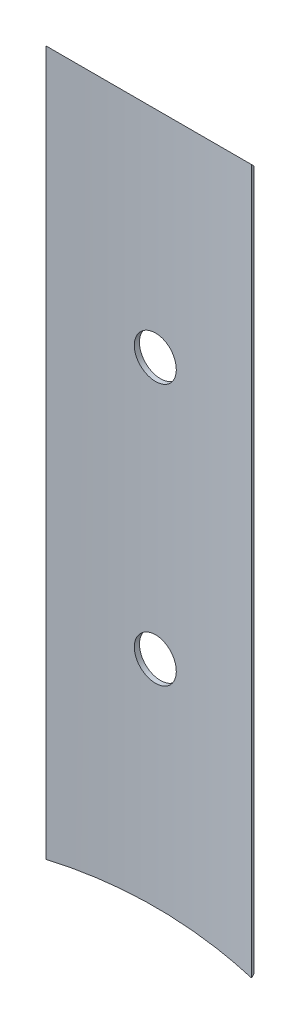
ISO-10303-21;
HEADER;
FILE_DESCRIPTION(('STEP AP214'),'2;1');
FILE_NAME('part.step','',(''),(''),'','','');
FILE_SCHEMA(('AUTOMOTIVE_DESIGN { 1 0 10303 214 1 1 1 1 }'));
ENDSEC;
DATA;
#1=APPLICATION_CONTEXT('core data for automotive mechanical design processes');
#2=APPLICATION_PROTOCOL_DEFINITION('international standard','automotive_design',2000,#1);
#3=PRODUCT_CONTEXT('',#1,'mechanical');
#4=PRODUCT('Part','Part','',(#3));
#5=PRODUCT_RELATED_PRODUCT_CATEGORY('part','',(#4));
#6=PRODUCT_DEFINITION_FORMATION('','',#4);
#7=PRODUCT_DEFINITION_CONTEXT('part definition',#1,'design');
#8=PRODUCT_DEFINITION('design','',#6,#7);
#9=PRODUCT_DEFINITION_SHAPE('','',#8);
#10=(LENGTH_UNIT() NAMED_UNIT(*) SI_UNIT(.MILLI.,.METRE.));
#11=(NAMED_UNIT(*) PLANE_ANGLE_UNIT() SI_UNIT($,.RADIAN.));
#12=(NAMED_UNIT(*) SI_UNIT($,.STERADIAN.) SOLID_ANGLE_UNIT());
#13=UNCERTAINTY_MEASURE_WITH_UNIT(LENGTH_MEASURE(1.E-05),#10,'distance_accuracy_value','');
#14=(GEOMETRIC_REPRESENTATION_CONTEXT(3) GLOBAL_UNCERTAINTY_ASSIGNED_CONTEXT((#13)) GLOBAL_UNIT_ASSIGNED_CONTEXT((#10,
#11,#12)) REPRESENTATION_CONTEXT('',''));
#15=CARTESIAN_POINT('',(0.,0.,0.));
#16=DIRECTION('',(0.,0.,1.));
#17=DIRECTION('',(1.,0.,0.));
#18=AXIS2_PLACEMENT_3D('',#15,#16,#17);
#19=CARTESIAN_POINT('',(0.,40.,84.5221864364618));
#20=DIRECTION('',(0.,-1.,0.));
#21=DIRECTION('',(0.,0.,-1.));
#22=AXIS2_PLACEMENT_3D('',#19,#20,#21);
#23=CYLINDRICAL_SURFACE('',#22,85.);
#24=CARTESIAN_POINT('',(-2.25,14.,-0.448028933395947));
#25=CARTESIAN_POINT('',(-2.24999440372877,14.1263597316723,-0.448029335489003));
#26=CARTESIAN_POINT('',(-2.23931975200101,14.2528105225971,-0.448313826455268));
#27=CARTESIAN_POINT('',(-2.1968854915202,14.5022279541677,-0.449421334938149));
#28=CARTESIAN_POINT('',(-2.16510065389573,14.6251902421219,-0.450244996803192));
#29=CARTESIAN_POINT('',(-2.08135295938417,14.8639812460017,-0.452337477286159));
#30=CARTESIAN_POINT('',(-2.02939992207416,14.9798134017272,-0.453606079240831));
#31=CARTESIAN_POINT('',(-1.90680453629696,15.2010796404811,-0.456445216413732));
#32=CARTESIAN_POINT('',(-1.8361667689135,15.3065162635783,-0.458015677596971));
#33=CARTESIAN_POINT('',(-1.67817448632661,15.5040718497568,-0.461282289839621));
#34=CARTESIAN_POINT('',(-1.5908145700805,15.5961864930855,-0.462978481399596));
#35=CARTESIAN_POINT('',(-1.40186675999497,15.7644471460762,-0.466305011805868));
#36=CARTESIAN_POINT('',(-1.30027830156906,15.8405925217804,-0.467935348035726));
#37=CARTESIAN_POINT('',(-1.08574335921645,15.974758135039,-0.470946544414543));
#38=CARTESIAN_POINT('',(-0.972795421391057,16.0327760485486,-0.472327372565572));
#39=CARTESIAN_POINT('',(-0.738758120452581,16.1290245801941,-0.474683608153952));
#40=CARTESIAN_POINT('',(-0.617668786373959,16.1672552688923,-0.475659017037049));
#41=CARTESIAN_POINT('',(-0.37081613566513,16.2228355684132,-0.477094255053028));
#42=CARTESIAN_POINT('',(-0.245053926969164,16.2401900967955,-0.477554205604817));
#43=CARTESIAN_POINT('',(0.00759955646062751,16.2535405829323,-0.47790708439672));
#44=CARTESIAN_POINT('',(0.134490827235479,16.2495366155495,-0.477800014624267));
#45=CARTESIAN_POINT('',(0.385767123080248,16.2202879521611,-0.477031027246604));
#46=CARTESIAN_POINT('',(0.51015276763715,16.195048574034,-0.476369248554553));
#47=CARTESIAN_POINT('',(0.752920863895877,16.1240537634113,-0.474565593185866));
#48=CARTESIAN_POINT('',(0.871303303918239,16.0782982910025,-0.47342371557522));
#49=CARTESIAN_POINT('',(1.09872159425895,15.9675640275676,-0.470788327973393));
#50=CARTESIAN_POINT('',(1.2077562568991,15.9025827984752,-0.469294773390083));
#51=CARTESIAN_POINT('',(1.4133708367869,15.7552434356078,-0.466124366640096));
#52=CARTESIAN_POINT('',(1.5099507329878,15.6728852724689,-0.46444751416368));
#53=CARTESIAN_POINT('',(1.68794523977451,15.4930997794337,-0.461098896767429));
#54=CARTESIAN_POINT('',(1.7693551875942,15.3956678331164,-0.459427133566679));
#55=CARTESIAN_POINT('',(1.9146629569889,15.1885168178678,-0.456277689204642));
#56=CARTESIAN_POINT('',(1.97856077583702,15.0787977470233,-0.454800008073577));
#57=CARTESIAN_POINT('',(2.08702992258864,14.8501844387096,-0.452205378413071));
#58=CARTESIAN_POINT('',(2.13160110256844,14.7312901310225,-0.451088432644671));
#59=CARTESIAN_POINT('',(2.20014876151045,14.487702533046,-0.449341330869842));
#60=CARTESIAN_POINT('',(2.22412528437684,14.3630092551195,-0.448711173825666));
#61=CARTESIAN_POINT('',(2.25079730376684,14.1114038892835,-0.44800888791358));
#62=CARTESIAN_POINT('',(2.2534992578269,13.9844924863715,-0.447936589717161));
#63=CARTESIAN_POINT('',(2.23756226536874,13.7320178403215,-0.448357731587819));
#64=CARTESIAN_POINT('',(2.21892333788552,13.6064545959811,-0.448851171150285));
#65=CARTESIAN_POINT('',(2.16083902445633,13.3602585853109,-0.450348007510172));
#66=CARTESIAN_POINT('',(2.12139657023948,13.2396251268331,-0.451351332451463));
#67=CARTESIAN_POINT('',(2.0228278151763,13.0066918221781,-0.453754770772312));
#68=CARTESIAN_POINT('',(1.96370148404357,12.8943919888236,-0.455154884762386));
#69=CARTESIAN_POINT('',(1.8274267198403,12.6812839935067,-0.458194476208078));
#70=CARTESIAN_POINT('',(1.75027393674913,12.5804786140584,-0.459834011403325));
#71=CARTESIAN_POINT('',(1.58014275109727,12.3932489782898,-0.463167410560859));
#72=CARTESIAN_POINT('',(1.48716431568065,12.3068247518271,-0.464861274635935));
#73=CARTESIAN_POINT('',(1.28799351401874,12.1507891849084,-0.468112869657872));
#74=CARTESIAN_POINT('',(1.18179788444174,12.0811820091171,-0.469670566822802));
#75=CARTESIAN_POINT('',(0.959223921422152,11.9607849406399,-0.4724737480364));
#76=CARTESIAN_POINT('',(0.842845608227877,11.9099950105368,-0.473719232705885));
#77=CARTESIAN_POINT('',(0.603225562997003,11.8286814664197,-0.475757424790894));
#78=CARTESIAN_POINT('',(0.479984748848116,11.7981551490877,-0.476550192600268));
#79=CARTESIAN_POINT('',(0.230125000802559,11.7582264893232,-0.477593822548198));
#80=CARTESIAN_POINT('',(0.10350606785991,11.748824140925,-0.477844684839792));
#81=CARTESIAN_POINT('',(-0.149473891579842,11.7514106473486,-0.47777622741419));
#82=CARTESIAN_POINT('',(-0.275834985362275,11.7633929309997,-0.477457082851369));
#83=CARTESIAN_POINT('',(-0.524751381763441,11.8083950744394,-0.476284920448033));
#84=CARTESIAN_POINT('',(-0.647306676816564,11.8414149760463,-0.47543190154629));
#85=CARTESIAN_POINT('',(-0.885135536384467,11.9275543146337,-0.47328808775105));
#86=CARTESIAN_POINT('',(-1.00040897464439,11.9806741000001,-0.471997285269608));
#87=CARTESIAN_POINT('',(-1.22039871769012,12.105502552721,-0.469123379347224));
#88=CARTESIAN_POINT('',(-1.32511541130946,12.1772105350741,-0.467540286678207));
#89=CARTESIAN_POINT('',(-1.52104812928938,12.3371972482214,-0.464259738566939));
#90=CARTESIAN_POINT('',(-1.6122614381822,12.4254793039107,-0.462562260221862));
#91=CARTESIAN_POINT('',(-1.77859693276097,12.6161293244317,-0.459244089428797));
#92=CARTESIAN_POINT('',(-1.85371512512774,12.718500774625,-0.457623416114213));
#93=CARTESIAN_POINT('',(-1.98573809244826,12.9344587475033,-0.454641118889554));
#94=CARTESIAN_POINT('',(-2.04263172270459,13.0480520772653,-0.453279653696231));
#95=CARTESIAN_POINT('',(-2.13647419422697,13.2830938849668,-0.450972280454713));
#96=CARTESIAN_POINT('',(-2.17344684718645,13.4045327896183,-0.450025876533649));
#97=CARTESIAN_POINT('',(-2.21658735736932,13.6056169382698,-0.448908627446915));
#98=CARTESIAN_POINT('',(-2.22910136101902,13.683956666606,-0.448580172696496));
#99=CARTESIAN_POINT('',(-2.24580943649872,13.8415189881185,-0.448140199590503));
#100=CARTESIAN_POINT('',(-2.25000351022912,13.9207415810931,-0.448028681185378));
#101=CARTESIAN_POINT('',(-2.25,14.,-0.448028933395947));
#102=B_SPLINE_CURVE_WITH_KNOTS('',3,(#24,#25,#26,#27,#28,#29,#30,#31,#32,#33,#34,#35,#36,#37,
#38,#39,#40,#41,#42,#43,#44,#45,#46,#47,#48,#49,#50,#51,#52,#53,#54,#55,#56,#57,#58,#59,#60,#61,
#62,#63,#64,#65,#66,#67,#68,#69,#70,#71,#72,#73,#74,#75,#76,#77,#78,#79,#80,#81,#82,#83,#84,#85,
#86,#87,#88,#89,#90,#91,#92,#93,#94,#95,#96,#97,#98,#99,#100,#101),.UNSPECIFIED.,.T.,.F.,(4,2,2,
2,2,2,2,2,2,2,2,2,2,2,2,2,2,2,2,2,2,2,2,2,2,2,2,2,2,2,2,2,2,2,2,2,2,2,4),(0.,0.378789893745727,
0.758033297428452,1.1370922846225,1.51605842091763,1.89514716565056,2.27425095683376,
2.65340333137427,3.03255435382474,3.41161604648291,3.79067641051244,4.16964187657836,
4.54860807990766,4.92762236150269,5.30663728356892,5.68576851145656,6.06489979838003,
6.44403398707584,6.82316736752212,7.20218566398905,7.58120362239078,7.96016818209627,
8.33913332489485,8.71819001160405,9.09724748528948,9.47639873480346,9.85554923039013,
10.234649134288,10.6137489311245,10.9927322564418,11.3717163350981,11.750706982883,
12.1296836663104,12.5087364569624,12.8878831848337,13.267261328111,13.6461849861367,
13.8837788345599,14.1213726287129),.UNSPECIFIED.);
#103=CARTESIAN_POINT('',(-2.25,14.,-0.448028933395947));
#104=VERTEX_POINT('',#103);
#105=EDGE_CURVE('E46',#104,#104,#102,.T.);
#106=ORIENTED_EDGE('',*,*,#105,.T.);
#107=EDGE_LOOP('',(#106));
#108=FACE_BOUND('',#107,.T.);
#109=CARTESIAN_POINT('',(-2.25,-14.,-0.448028933395947));
#110=CARTESIAN_POINT('',(-2.24999440372877,-13.8736402683277,-0.448029335489003));
#111=CARTESIAN_POINT('',(-2.23931975200101,-13.7471894774029,-0.448313826455268));
#112=CARTESIAN_POINT('',(-2.1968854915202,-13.4977720458323,-0.449421334938149));
#113=CARTESIAN_POINT('',(-2.16510065389573,-13.3748097578781,-0.450244996803192));
#114=CARTESIAN_POINT('',(-2.08135295938417,-13.1360187539983,-0.452337477286159));
#115=CARTESIAN_POINT('',(-2.02939992207416,-13.0201865982728,-0.453606079240831));
#116=CARTESIAN_POINT('',(-1.90680453629696,-12.7989203595189,-0.456445216413732));
#117=CARTESIAN_POINT('',(-1.8361667689135,-12.6934837364217,-0.458015677596971));
#118=CARTESIAN_POINT('',(-1.67817448632661,-12.4959281502432,-0.461282289839621));
#119=CARTESIAN_POINT('',(-1.59081457008051,-12.4038135069145,-0.462978481399596));
#120=CARTESIAN_POINT('',(-1.40186675999497,-12.2355528539238,-0.466305011805868));
#121=CARTESIAN_POINT('',(-1.30027830156906,-12.1594074782196,-0.467935348035726));
#122=CARTESIAN_POINT('',(-1.08574335921645,-12.025241864961,-0.470946544414543));
#123=CARTESIAN_POINT('',(-0.972795421391058,-11.9672239514514,-0.472327372565573));
#124=CARTESIAN_POINT('',(-0.738758120452582,-11.8709754198059,-0.474683608153952));
#125=CARTESIAN_POINT('',(-0.61766878637396,-11.8327447311077,-0.475659017037049));
#126=CARTESIAN_POINT('',(-0.37081613566513,-11.7771644315868,-0.477094255053028));
#127=CARTESIAN_POINT('',(-0.245053926969164,-11.7598099032045,-0.477554205604817));
#128=CARTESIAN_POINT('',(0.00759955646062716,-11.7464594170677,-0.47790708439672));
#129=CARTESIAN_POINT('',(0.134490827235479,-11.7504633844505,-0.477800014624267));
#130=CARTESIAN_POINT('',(0.385767123080248,-11.7797120478389,-0.477031027246604));
#131=CARTESIAN_POINT('',(0.510152767637151,-11.804951425966,-0.476369248554553));
#132=CARTESIAN_POINT('',(0.752920863895878,-11.8759462365887,-0.474565593185866));
#133=CARTESIAN_POINT('',(0.87130330391824,-11.9217017089975,-0.47342371557522));
#134=CARTESIAN_POINT('',(1.09872159425895,-12.0324359724324,-0.470788327973393));
#135=CARTESIAN_POINT('',(1.2077562568991,-12.0974172015248,-0.469294773390083));
#136=CARTESIAN_POINT('',(1.4133708367869,-12.2447565643922,-0.466124366640096));
#137=CARTESIAN_POINT('',(1.5099507329878,-12.3271147275311,-0.46444751416368));
#138=CARTESIAN_POINT('',(1.68794523977451,-12.5069002205663,-0.461098896767429));
#139=CARTESIAN_POINT('',(1.7693551875942,-12.6043321668836,-0.459427133566679));
#140=CARTESIAN_POINT('',(1.9146629569889,-12.8114831821322,-0.456277689204642));
#141=CARTESIAN_POINT('',(1.97856077583702,-12.9212022529767,-0.454800008073577));
#142=CARTESIAN_POINT('',(2.08702992258864,-13.1498155612904,-0.452205378413071));
#143=CARTESIAN_POINT('',(2.13160110256844,-13.2687098689775,-0.451088432644671));
#144=CARTESIAN_POINT('',(2.20014876151045,-13.512297466954,-0.449341330869842));
#145=CARTESIAN_POINT('',(2.22412528437684,-13.6369907448805,-0.448711173825666));
#146=CARTESIAN_POINT('',(2.25079730376684,-13.8885961107165,-0.44800888791358));
#147=CARTESIAN_POINT('',(2.2534992578269,-14.0155075136285,-0.447936589717161));
#148=CARTESIAN_POINT('',(2.23756226536874,-14.2679821596785,-0.448357731587819));
#149=CARTESIAN_POINT('',(2.21892333788552,-14.3935454040189,-0.448851171150285));
#150=CARTESIAN_POINT('',(2.16083902445634,-14.6397414146891,-0.450348007510172));
#151=CARTESIAN_POINT('',(2.12139657023948,-14.7603748731669,-0.451351332451463));
#152=CARTESIAN_POINT('',(2.0228278151763,-14.9933081778219,-0.453754770772312));
#153=CARTESIAN_POINT('',(1.96370148404357,-15.1056080111764,-0.455154884762386));
#154=CARTESIAN_POINT('',(1.8274267198403,-15.3187160064933,-0.458194476208078));
#155=CARTESIAN_POINT('',(1.75027393674913,-15.4195213859416,-0.459834011403325));
#156=CARTESIAN_POINT('',(1.58014275109727,-15.6067510217102,-0.463167410560859));
#157=CARTESIAN_POINT('',(1.48716431568065,-15.6931752481729,-0.464861274635935));
#158=CARTESIAN_POINT('',(1.28799351401874,-15.8492108150916,-0.468112869657872));
#159=CARTESIAN_POINT('',(1.18179788444175,-15.9188179908829,-0.469670566822802));
#160=CARTESIAN_POINT('',(0.959223921422154,-16.0392150593601,-0.4724737480364));
#161=CARTESIAN_POINT('',(0.842845608227879,-16.0900049894632,-0.473719232705884));
#162=CARTESIAN_POINT('',(0.603225562997004,-16.1713185335803,-0.475757424790894));
#163=CARTESIAN_POINT('',(0.479984748848118,-16.2018448509123,-0.476550192600268));
#164=CARTESIAN_POINT('',(0.23012500080256,-16.2417735106768,-0.477593822548197));
#165=CARTESIAN_POINT('',(0.103506067859912,-16.251175859075,-0.477844684839792));
#166=CARTESIAN_POINT('',(-0.149473891579841,-16.2485893526514,-0.47777622741419));
#167=CARTESIAN_POINT('',(-0.275834985362274,-16.2366070690003,-0.477457082851369));
#168=CARTESIAN_POINT('',(-0.524751381763441,-16.1916049255606,-0.476284920448033));
#169=CARTESIAN_POINT('',(-0.647306676816564,-16.1585850239537,-0.47543190154629));
#170=CARTESIAN_POINT('',(-0.885135536384468,-16.0724456853663,-0.47328808775105));
#171=CARTESIAN_POINT('',(-1.00040897464439,-16.0193258999999,-0.471997285269608));
#172=CARTESIAN_POINT('',(-1.22039871769012,-15.894497447279,-0.469123379347224));
#173=CARTESIAN_POINT('',(-1.32511541130946,-15.8227894649259,-0.467540286678207));
#174=CARTESIAN_POINT('',(-1.52104812928938,-15.6628027517786,-0.464259738566939));
#175=CARTESIAN_POINT('',(-1.6122614381822,-15.5745206960893,-0.462562260221862));
#176=CARTESIAN_POINT('',(-1.77859693276097,-15.3838706755683,-0.459244089428797));
#177=CARTESIAN_POINT('',(-1.85371512512774,-15.281499225375,-0.457623416114213));
#178=CARTESIAN_POINT('',(-1.98573809244826,-15.0655412524967,-0.454641118889554));
#179=CARTESIAN_POINT('',(-2.04263172270459,-14.9519479227347,-0.453279653696231));
#180=CARTESIAN_POINT('',(-2.13647419422697,-14.7169061150332,-0.450972280454713));
#181=CARTESIAN_POINT('',(-2.17344684718645,-14.5954672103817,-0.450025876533649));
#182=CARTESIAN_POINT('',(-2.21658735736932,-14.3943830617302,-0.448908627446915));
#183=CARTESIAN_POINT('',(-2.22910136101902,-14.316043333394,-0.448580172696496));
#184=CARTESIAN_POINT('',(-2.24580943649872,-14.1584810118815,-0.448140199590503));
#185=CARTESIAN_POINT('',(-2.25000351022912,-14.0792584189069,-0.448028681185378));
#186=CARTESIAN_POINT('',(-2.25,-14.,-0.448028933395947));
#187=B_SPLINE_CURVE_WITH_KNOTS('',3,(#109,#110,#111,#112,#113,#114,#115,#116,#117,#118,#119,
#120,#121,#122,#123,#124,#125,#126,#127,#128,#129,#130,#131,#132,#133,#134,#135,#136,#137,#138,
#139,#140,#141,#142,#143,#144,#145,#146,#147,#148,#149,#150,#151,#152,#153,#154,#155,#156,#157,
#158,#159,#160,#161,#162,#163,#164,#165,#166,#167,#168,#169,#170,#171,#172,#173,#174,#175,#176,
#177,#178,#179,#180,#181,#182,#183,#184,#185,#186),.UNSPECIFIED.,.T.,.F.,(4,2,2,2,2,2,2,2,2,2,2,
2,2,2,2,2,2,2,2,2,2,2,2,2,2,2,2,2,2,2,2,2,2,2,2,2,2,2,4),(0.,0.378789893745727,
0.758033297428452,1.1370922846225,1.51605842091763,1.89514716565055,2.27425095683376,
2.65340333137427,3.03255435382474,3.41161604648291,3.79067641051244,4.16964187657836,
4.54860807990766,4.92762236150269,5.30663728356892,5.68576851145656,6.06489979838003,
6.44403398707584,6.82316736752212,7.20218566398905,7.58120362239078,7.96016818209627,
8.33913332489485,8.71819001160405,9.09724748528948,9.47639873480346,9.85554923039013,
10.234649134288,10.6137489311245,10.9927322564418,11.3717163350981,11.750706982883,
12.1296836663104,12.5087364569624,12.8878831848337,13.267261328111,13.6461849861367,
13.8837788345599,14.1213726287129),.UNSPECIFIED.);
#188=CARTESIAN_POINT('',(-2.25,-14.,-0.448028933395947));
#189=VERTEX_POINT('',#188);
#190=EDGE_CURVE('E142',#189,#189,#187,.T.);
#191=ORIENTED_EDGE('',*,*,#190,.T.);
#192=EDGE_LOOP('',(#191));
#193=FACE_BOUND('',#192,.T.);
#194=CARTESIAN_POINT('',(0.,122.022186436463,84.5221864364618));
#195=DIRECTION('',(0.,0.707106781186544,-0.707106781186552));
#196=DIRECTION('',(0.,-0.707106781186551,-0.707106781186544));
#197=AXIS2_PLACEMENT_3D('',#194,#195,#196);
#198=ELLIPSE('',#197,120.208152801714,85.);
#199=CARTESIAN_POINT('',(-11.,37.7369564136398,0.236956413639841));
#200=VERTEX_POINT('',#199);
#201=CARTESIAN_POINT('',(11.,37.7369564136398,0.236956413639841));
#202=VERTEX_POINT('',#201);
#203=EDGE_CURVE('E123',#200,#202,#198,.F.);
#204=ORIENTED_EDGE('',*,*,#203,.F.);
#205=DIRECTION('',(0.,-1.,0.));
#206=VECTOR('',#205,1.);
#207=CARTESIAN_POINT('',(-11.,40.,0.236956413639841));
#208=LINE('',#207,#206);
#209=CARTESIAN_POINT('',(-11.,-37.7369564136398,0.236956413639841));
#210=VERTEX_POINT('',#209);
#211=EDGE_CURVE('E133',#200,#210,#208,.T.);
#212=ORIENTED_EDGE('',*,*,#211,.T.);
#213=CARTESIAN_POINT('',(0.,-122.022186436463,84.5221864364618));
#214=DIRECTION('',(0.,-0.707106781186544,-0.707106781186552));
#215=DIRECTION('',(0.,-0.707106781186551,0.707106781186544));
#216=AXIS2_PLACEMENT_3D('',#213,#214,#215);
#217=ELLIPSE('',#216,120.208152801714,85.);
#218=CARTESIAN_POINT('',(11.,-37.7369564136398,0.236956413639841));
#219=VERTEX_POINT('',#218);
#220=EDGE_CURVE('E71',#219,#210,#217,.F.);
#221=ORIENTED_EDGE('',*,*,#220,.F.);
#222=DIRECTION('',(0.,-1.,0.));
#223=VECTOR('',#222,1.);
#224=CARTESIAN_POINT('',(11.,40.,0.236956413639841));
#225=LINE('',#224,#223);
#226=EDGE_CURVE('E12',#202,#219,#225,.T.);
#227=ORIENTED_EDGE('',*,*,#226,.F.);
#228=EDGE_LOOP('',(#204,#212,#221,#227));
#229=FACE_BOUND('',#228,.T.);
#230=ADVANCED_FACE('F42',(#108,#193,#229),#23,.F.);
#231=CARTESIAN_POINT('',(11.,40.,0.236956413639841));
#232=DIRECTION('',(-1.,0.,0.));
#233=DIRECTION('',(0.,0.,1.));
#234=AXIS2_PLACEMENT_3D('',#231,#232,#233);
#235=PLANE('',#234);
#236=DIRECTION('',(0.,0.707106781186551,0.707106781186543));
#237=VECTOR('',#236,1.);
#238=CARTESIAN_POINT('',(11.,36.5,-1.));
#239=LINE('',#238,#237);
#240=CARTESIAN_POINT('',(11.,37.5,0.));
#241=VERTEX_POINT('',#240);
#242=EDGE_CURVE('E126',#241,#202,#239,.T.);
#243=ORIENTED_EDGE('',*,*,#242,.T.);
#244=ORIENTED_EDGE('',*,*,#226,.T.);
#245=DIRECTION('',(0.,0.707106781186551,-0.707106781186543));
#246=VECTOR('',#245,1.);
#247=CARTESIAN_POINT('',(11.,-37.7369564136398,0.236956413639841));
#248=LINE('',#247,#246);
#249=CARTESIAN_POINT('',(11.,-37.5,0.));
#250=VERTEX_POINT('',#249);
#251=EDGE_CURVE('E141',#219,#250,#248,.T.);
#252=ORIENTED_EDGE('',*,*,#251,.T.);
#253=DIRECTION('',(0.,-1.,0.));
#254=VECTOR('',#253,1.);
#255=CARTESIAN_POINT('',(11.,40.,0.));
#256=LINE('',#255,#254);
#257=EDGE_CURVE('E55',#241,#250,#256,.T.);
#258=ORIENTED_EDGE('',*,*,#257,.F.);
#259=EDGE_LOOP('',(#243,#244,#252,#258));
#260=FACE_BOUND('',#259,.T.);
#261=ADVANCED_FACE('F138',(#260),#235,.F.);
#262=CARTESIAN_POINT('',(9.5,40.,0.));
#263=DIRECTION('',(0.,0.,1.));
#264=DIRECTION('',(1.,0.,0.));
#265=AXIS2_PLACEMENT_3D('',#262,#263,#264);
#266=PLANE('',#265);
#267=DIRECTION('',(-1.,0.,0.));
#268=VECTOR('',#267,1.);
#269=CARTESIAN_POINT('',(9.5,37.5,0.));
#270=LINE('',#269,#268);
#271=CARTESIAN_POINT('',(9.5,37.5,0.));
#272=VERTEX_POINT('',#271);
#273=EDGE_CURVE('E134',#241,#272,#270,.T.);
#274=ORIENTED_EDGE('',*,*,#273,.F.);
#275=ORIENTED_EDGE('',*,*,#257,.T.);
#276=DIRECTION('',(1.,0.,0.));
#277=VECTOR('',#276,1.);
#278=CARTESIAN_POINT('',(9.5,-37.5,0.));
#279=LINE('',#278,#277);
#280=CARTESIAN_POINT('',(9.5,-37.5,0.));
#281=VERTEX_POINT('',#280);
#282=EDGE_CURVE('E144',#281,#250,#279,.T.);
#283=ORIENTED_EDGE('',*,*,#282,.F.);
#284=DIRECTION('',(0.,-1.,0.));
#285=VECTOR('',#284,1.);
#286=CARTESIAN_POINT('',(9.5,40.,0.));
#287=LINE('',#286,#285);
#288=EDGE_CURVE('E179',#272,#281,#287,.T.);
#289=ORIENTED_EDGE('',*,*,#288,.F.);
#290=EDGE_LOOP('',(#274,#275,#283,#289));
#291=FACE_BOUND('',#290,.T.);
#292=ADVANCED_FACE('F227',(#291),#266,.F.);
#293=CARTESIAN_POINT('',(9.,40.,-0.5));
#294=DIRECTION('',(-0.707106781186548,0.,0.707106781186547));
#295=DIRECTION('',(0.707106781186547,0.,0.707106781186548));
#296=AXIS2_PLACEMENT_3D('',#293,#294,#295);
#297=PLANE('',#296);
#298=DIRECTION('',(-0.577350269189623,-0.577350269189631,-0.577350269189624));
#299=VECTOR('',#298,1.);
#300=CARTESIAN_POINT('',(10.,38.,0.500000000000011));
#301=LINE('',#300,#299);
#302=CARTESIAN_POINT('',(9.,37.,-0.5));
#303=VERTEX_POINT('',#302);
#304=EDGE_CURVE('E157',#272,#303,#301,.T.);
#305=ORIENTED_EDGE('',*,*,#304,.F.);
#306=ORIENTED_EDGE('',*,*,#288,.T.);
#307=DIRECTION('',(0.577350269189623,-0.577350269189631,0.577350269189624));
#308=VECTOR('',#307,1.);
#309=CARTESIAN_POINT('',(-16.6666666666667,-11.3333333333329,-26.1666666666668));
#310=LINE('',#309,#308);
#311=CARTESIAN_POINT('',(9.,-37.,-0.5));
#312=VERTEX_POINT('',#311);
#313=EDGE_CURVE('E148',#312,#281,#310,.T.);
#314=ORIENTED_EDGE('',*,*,#313,.F.);
#315=DIRECTION('',(0.,-1.,0.));
#316=VECTOR('',#315,1.);
#317=CARTESIAN_POINT('',(9.,40.,-0.5));
#318=LINE('',#317,#316);
#319=EDGE_CURVE('E176',#303,#312,#318,.T.);
#320=ORIENTED_EDGE('',*,*,#319,.F.);
#321=EDGE_LOOP('',(#305,#306,#314,#320));
#322=FACE_BOUND('',#321,.T.);
#323=ADVANCED_FACE('F223',(#322),#297,.F.);
#324=CARTESIAN_POINT('',(9.,40.,-1.));
#325=DIRECTION('',(-1.,0.,0.));
#326=DIRECTION('',(0.,0.,1.));
#327=AXIS2_PLACEMENT_3D('',#324,#325,#326);
#328=PLANE('',#327);
#329=DIRECTION('',(0.,-0.707106781186551,-0.707106781186544));
#330=VECTOR('',#329,1.);
#331=CARTESIAN_POINT('',(9.,38.25,0.750000000000012));
#332=LINE('',#331,#330);
#333=CARTESIAN_POINT('',(9.,36.5,-1.));
#334=VERTEX_POINT('',#333);
#335=EDGE_CURVE('E155',#303,#334,#332,.T.);
#336=ORIENTED_EDGE('',*,*,#335,.F.);
#337=ORIENTED_EDGE('',*,*,#319,.T.);
#338=DIRECTION('',(0.,-0.707106781186551,0.707106781186544));
#339=VECTOR('',#338,1.);
#340=CARTESIAN_POINT('',(9.,1.75000000000044,-39.25));
#341=LINE('',#340,#339);
#342=CARTESIAN_POINT('',(9.,-36.5,-1.));
#343=VERTEX_POINT('',#342);
#344=EDGE_CURVE('E267',#343,#312,#341,.T.);
#345=ORIENTED_EDGE('',*,*,#344,.F.);
#346=DIRECTION('',(0.,-1.,0.));
#347=VECTOR('',#346,1.);
#348=CARTESIAN_POINT('',(9.,40.,-1.));
#349=LINE('',#348,#347);
#350=EDGE_CURVE('E173',#334,#343,#349,.T.);
#351=ORIENTED_EDGE('',*,*,#350,.F.);
#352=EDGE_LOOP('',(#336,#337,#345,#351));
#353=FACE_BOUND('',#352,.T.);
#354=ADVANCED_FACE('F219',(#353),#328,.F.);
#355=CARTESIAN_POINT('',(-9.,40.,-1.));
#356=DIRECTION('',(0.,0.,1.));
#357=DIRECTION('',(1.,0.,0.));
#358=AXIS2_PLACEMENT_3D('',#355,#356,#357);
#359=PLANE('',#358);
#360=CARTESIAN_POINT('',(0.,14.,-1.));
#361=DIRECTION('',(0.,0.,-1.));
#362=DIRECTION('',(-1.,0.,0.));
#363=AXIS2_PLACEMENT_3D('',#360,#361,#362);
#364=CIRCLE('',#363,2.25);
#365=CARTESIAN_POINT('',(-2.25,14.,-1.));
#366=VERTEX_POINT('',#365);
#367=EDGE_CURVE('E244',#366,#366,#364,.T.);
#368=ORIENTED_EDGE('',*,*,#367,.F.);
#369=EDGE_LOOP('',(#368));
#370=FACE_BOUND('',#369,.T.);
#371=CARTESIAN_POINT('',(0.,-14.,-1.));
#372=DIRECTION('',(0.,0.,-1.));
#373=DIRECTION('',(-1.,0.,0.));
#374=AXIS2_PLACEMENT_3D('',#371,#372,#373);
#375=CIRCLE('',#374,2.25);
#376=CARTESIAN_POINT('',(-2.25,-14.,-1.));
#377=VERTEX_POINT('',#376);
#378=EDGE_CURVE('E187',#377,#377,#375,.T.);
#379=ORIENTED_EDGE('',*,*,#378,.F.);
#380=EDGE_LOOP('',(#379));
#381=FACE_BOUND('',#380,.T.);
#382=DIRECTION('',(1.,0.,0.));
#383=VECTOR('',#382,1.);
#384=CARTESIAN_POINT('',(-11.,36.5,-1.));
#385=LINE('',#384,#383);
#386=CARTESIAN_POINT('',(-9.,36.5,-1.));
#387=VERTEX_POINT('',#386);
#388=EDGE_CURVE('E257',#387,#334,#385,.T.);
#389=ORIENTED_EDGE('',*,*,#388,.T.);
#390=ORIENTED_EDGE('',*,*,#350,.T.);
#391=DIRECTION('',(1.,0.,0.));
#392=VECTOR('',#391,1.);
#393=CARTESIAN_POINT('',(-11.,-36.5,-1.));
#394=LINE('',#393,#392);
#395=CARTESIAN_POINT('',(-9.,-36.5,-1.));
#396=VERTEX_POINT('',#395);
#397=EDGE_CURVE('E256',#396,#343,#394,.T.);
#398=ORIENTED_EDGE('',*,*,#397,.F.);
#399=DIRECTION('',(0.,-1.,0.));
#400=VECTOR('',#399,1.);
#401=CARTESIAN_POINT('',(-9.,40.,-1.));
#402=LINE('',#401,#400);
#403=EDGE_CURVE('E170',#387,#396,#402,.T.);
#404=ORIENTED_EDGE('',*,*,#403,.F.);
#405=EDGE_LOOP('',(#389,#390,#398,#404));
#406=FACE_BOUND('',#405,.T.);
#407=ADVANCED_FACE('F215',(#370,#381,#406),#359,.F.);
#408=CARTESIAN_POINT('',(-9.,40.,-1.));
#409=DIRECTION('',(1.,0.,0.));
#410=DIRECTION('',(0.,0.,-1.));
#411=AXIS2_PLACEMENT_3D('',#408,#409,#410);
#412=PLANE('',#411);
#413=DIRECTION('',(0.,0.707106781186551,0.707106781186544));
#414=VECTOR('',#413,1.);
#415=CARTESIAN_POINT('',(-9.,38.25,0.750000000000012));
#416=LINE('',#415,#414);
#417=CARTESIAN_POINT('',(-9.,37.,-0.5));
#418=VERTEX_POINT('',#417);
#419=EDGE_CURVE('E153',#387,#418,#416,.T.);
#420=ORIENTED_EDGE('',*,*,#419,.F.);
#421=ORIENTED_EDGE('',*,*,#403,.T.);
#422=DIRECTION('',(0.,0.707106781186551,-0.707106781186544));
#423=VECTOR('',#422,1.);
#424=CARTESIAN_POINT('',(-9.,1.75000000000044,-39.25));
#425=LINE('',#424,#423);
#426=CARTESIAN_POINT('',(-9.,-37.,-0.500000000000004));
#427=VERTEX_POINT('',#426);
#428=EDGE_CURVE('E265',#427,#396,#425,.T.);
#429=ORIENTED_EDGE('',*,*,#428,.F.);
#430=DIRECTION('',(0.,-1.,0.));
#431=VECTOR('',#430,1.);
#432=CARTESIAN_POINT('',(-9.,40.,-0.500000000000001));
#433=LINE('',#432,#431);
#434=EDGE_CURVE('E167',#418,#427,#433,.T.);
#435=ORIENTED_EDGE('',*,*,#434,.F.);
#436=EDGE_LOOP('',(#420,#421,#429,#435));
#437=FACE_BOUND('',#436,.T.);
#438=ADVANCED_FACE('F211',(#437),#412,.F.);
#439=CARTESIAN_POINT('',(-9.,40.,-0.500000000000001));
#440=DIRECTION('',(0.707106781186548,0.,0.707106781186547));
#441=DIRECTION('',(0.707106781186547,0.,-0.707106781186548));
#442=AXIS2_PLACEMENT_3D('',#439,#440,#441);
#443=PLANE('',#442);
#444=DIRECTION('',(-0.577350269189624,0.57735026918963,0.577350269189624));
#445=VECTOR('',#444,1.);
#446=CARTESIAN_POINT('',(-10.,38.,0.500000000000009));
#447=LINE('',#446,#445);
#448=CARTESIAN_POINT('',(-9.5,37.5,0.));
#449=VERTEX_POINT('',#448);
#450=EDGE_CURVE('E146',#418,#449,#447,.T.);
#451=ORIENTED_EDGE('',*,*,#450,.F.);
#452=ORIENTED_EDGE('',*,*,#434,.T.);
#453=DIRECTION('',(0.577350269189624,0.57735026918963,-0.577350269189624));
#454=VECTOR('',#453,1.);
#455=CARTESIAN_POINT('',(16.6666666666668,-11.3333333333329,-26.1666666666668));
#456=LINE('',#455,#454);
#457=CARTESIAN_POINT('',(-9.5,-37.5,0.));
#458=VERTEX_POINT('',#457);
#459=EDGE_CURVE('E263',#458,#427,#456,.T.);
#460=ORIENTED_EDGE('',*,*,#459,.F.);
#461=DIRECTION('',(0.,-1.,0.));
#462=VECTOR('',#461,1.);
#463=CARTESIAN_POINT('',(-9.5,40.,0.));
#464=LINE('',#463,#462);
#465=EDGE_CURVE('E164',#449,#458,#464,.T.);
#466=ORIENTED_EDGE('',*,*,#465,.F.);
#467=EDGE_LOOP('',(#451,#452,#460,#466));
#468=FACE_BOUND('',#467,.T.);
#469=ADVANCED_FACE('F207',(#468),#443,.F.);
#470=CARTESIAN_POINT('',(-9.5,40.,0.));
#471=DIRECTION('',(0.,0.,1.));
#472=DIRECTION('',(1.,0.,0.));
#473=AXIS2_PLACEMENT_3D('',#470,#471,#472);
#474=PLANE('',#473);
#475=DIRECTION('',(-1.,0.,0.));
#476=VECTOR('',#475,1.);
#477=CARTESIAN_POINT('',(-9.5,37.5,0.));
#478=LINE('',#477,#476);
#479=CARTESIAN_POINT('',(-11.,37.5,0.));
#480=VERTEX_POINT('',#479);
#481=EDGE_CURVE('E63',#449,#480,#478,.T.);
#482=ORIENTED_EDGE('',*,*,#481,.F.);
#483=ORIENTED_EDGE('',*,*,#465,.T.);
#484=DIRECTION('',(1.,0.,0.));
#485=VECTOR('',#484,1.);
#486=CARTESIAN_POINT('',(-9.5,-37.5,0.));
#487=LINE('',#486,#485);
#488=CARTESIAN_POINT('',(-11.,-37.5,0.));
#489=VERTEX_POINT('',#488);
#490=EDGE_CURVE('E260',#489,#458,#487,.T.);
#491=ORIENTED_EDGE('',*,*,#490,.F.);
#492=DIRECTION('',(0.,-1.,0.));
#493=VECTOR('',#492,1.);
#494=CARTESIAN_POINT('',(-11.,40.,0.));
#495=LINE('',#494,#493);
#496=EDGE_CURVE('E161',#480,#489,#495,.T.);
#497=ORIENTED_EDGE('',*,*,#496,.F.);
#498=EDGE_LOOP('',(#482,#483,#491,#497));
#499=FACE_BOUND('',#498,.T.);
#500=ADVANCED_FACE('F203',(#499),#474,.F.);
#501=CARTESIAN_POINT('',(-11.,40.,0.236956413639841));
#502=DIRECTION('',(1.,0.,0.));
#503=DIRECTION('',(0.,0.,-1.));
#504=AXIS2_PLACEMENT_3D('',#501,#502,#503);
#505=PLANE('',#504);
#506=DIRECTION('',(0.,0.707106781186551,0.707106781186543));
#507=VECTOR('',#506,1.);
#508=CARTESIAN_POINT('',(-11.,36.5,-1.));
#509=LINE('',#508,#507);
#510=EDGE_CURVE('E128',#480,#200,#509,.T.);
#511=ORIENTED_EDGE('',*,*,#510,.F.);
#512=ORIENTED_EDGE('',*,*,#496,.T.);
#513=DIRECTION('',(0.,0.707106781186551,-0.707106781186543));
#514=VECTOR('',#513,1.);
#515=CARTESIAN_POINT('',(-11.,-37.7369564136398,0.236956413639841));
#516=LINE('',#515,#514);
#517=EDGE_CURVE('E254',#210,#489,#516,.T.);
#518=ORIENTED_EDGE('',*,*,#517,.F.);
#519=ORIENTED_EDGE('',*,*,#211,.F.);
#520=EDGE_LOOP('',(#511,#512,#518,#519));
#521=FACE_BOUND('',#520,.T.);
#522=ADVANCED_FACE('F198',(#521),#505,.F.);
#523=CARTESIAN_POINT('',(-11.,-37.7369564136398,0.236956413639841));
#524=DIRECTION('',(0.,-0.707106781186544,-0.707106781186552));
#525=DIRECTION('',(0.,0.707106781186551,-0.707106781186544));
#526=AXIS2_PLACEMENT_3D('',#523,#524,#525);
#527=PLANE('',#526);
#528=ORIENTED_EDGE('',*,*,#220,.T.);
#529=ORIENTED_EDGE('',*,*,#517,.T.);
#530=ORIENTED_EDGE('',*,*,#490,.T.);
#531=ORIENTED_EDGE('',*,*,#459,.T.);
#532=ORIENTED_EDGE('',*,*,#428,.T.);
#533=ORIENTED_EDGE('',*,*,#397,.T.);
#534=ORIENTED_EDGE('',*,*,#344,.T.);
#535=ORIENTED_EDGE('',*,*,#313,.T.);
#536=ORIENTED_EDGE('',*,*,#282,.T.);
#537=ORIENTED_EDGE('',*,*,#251,.F.);
#538=EDGE_LOOP('',(#528,#529,#530,#531,#532,#533,#534,#535,#536,#537));
#539=FACE_BOUND('',#538,.T.);
#540=ADVANCED_FACE('F195',(#539),#527,.T.);
#541=CARTESIAN_POINT('',(-11.,36.5,-1.));
#542=DIRECTION('',(0.,0.707106781186544,-0.707106781186552));
#543=DIRECTION('',(0.,0.707106781186551,0.707106781186544));
#544=AXIS2_PLACEMENT_3D('',#541,#542,#543);
#545=PLANE('',#544);
#546=ORIENTED_EDGE('',*,*,#203,.T.);
#547=ORIENTED_EDGE('',*,*,#242,.F.);
#548=ORIENTED_EDGE('',*,*,#273,.T.);
#549=ORIENTED_EDGE('',*,*,#304,.T.);
#550=ORIENTED_EDGE('',*,*,#335,.T.);
#551=ORIENTED_EDGE('',*,*,#388,.F.);
#552=ORIENTED_EDGE('',*,*,#419,.T.);
#553=ORIENTED_EDGE('',*,*,#450,.T.);
#554=ORIENTED_EDGE('',*,*,#481,.T.);
#555=ORIENTED_EDGE('',*,*,#510,.T.);
#556=EDGE_LOOP('',(#546,#547,#548,#549,#550,#551,#552,#553,#554,#555));
#557=FACE_BOUND('',#556,.T.);
#558=ADVANCED_FACE('F125',(#557),#545,.T.);
#559=CARTESIAN_POINT('',(0.,-14.,-1.));
#560=DIRECTION('',(0.,0.,-1.));
#561=DIRECTION('',(-1.,0.,0.));
#562=AXIS2_PLACEMENT_3D('',#559,#560,#561);
#563=CYLINDRICAL_SURFACE('',#562,2.25);
#564=ORIENTED_EDGE('',*,*,#378,.T.);
#565=EDGE_LOOP('',(#564));
#566=FACE_BOUND('',#565,.T.);
#567=ORIENTED_EDGE('',*,*,#190,.F.);
#568=EDGE_LOOP('',(#567));
#569=FACE_BOUND('',#568,.T.);
#570=ADVANCED_FACE('F188',(#566,#569),#563,.F.);
#571=CARTESIAN_POINT('',(0.,14.,-1.));
#572=DIRECTION('',(0.,0.,-1.));
#573=DIRECTION('',(-1.,0.,0.));
#574=AXIS2_PLACEMENT_3D('',#571,#572,#573);
#575=CYLINDRICAL_SURFACE('',#574,2.25);
#576=ORIENTED_EDGE('',*,*,#367,.T.);
#577=EDGE_LOOP('',(#576));
#578=FACE_BOUND('',#577,.T.);
#579=ORIENTED_EDGE('',*,*,#105,.F.);
#580=EDGE_LOOP('',(#579));
#581=FACE_BOUND('',#580,.T.);
#582=ADVANCED_FACE('F192',(#578,#581),#575,.F.);
#583=CLOSED_SHELL('',(#230,#261,#292,#323,#354,#407,#438,#469,#500,#522,#540,#558,#570,#582));
#584=MANIFOLD_SOLID_BREP('B2',#583);
#585=ADVANCED_BREP_SHAPE_REPRESENTATION('',(#18,#584),#14);
#586=SHAPE_DEFINITION_REPRESENTATION(#9,#585);
ENDSEC;
END-ISO-10303-21;
